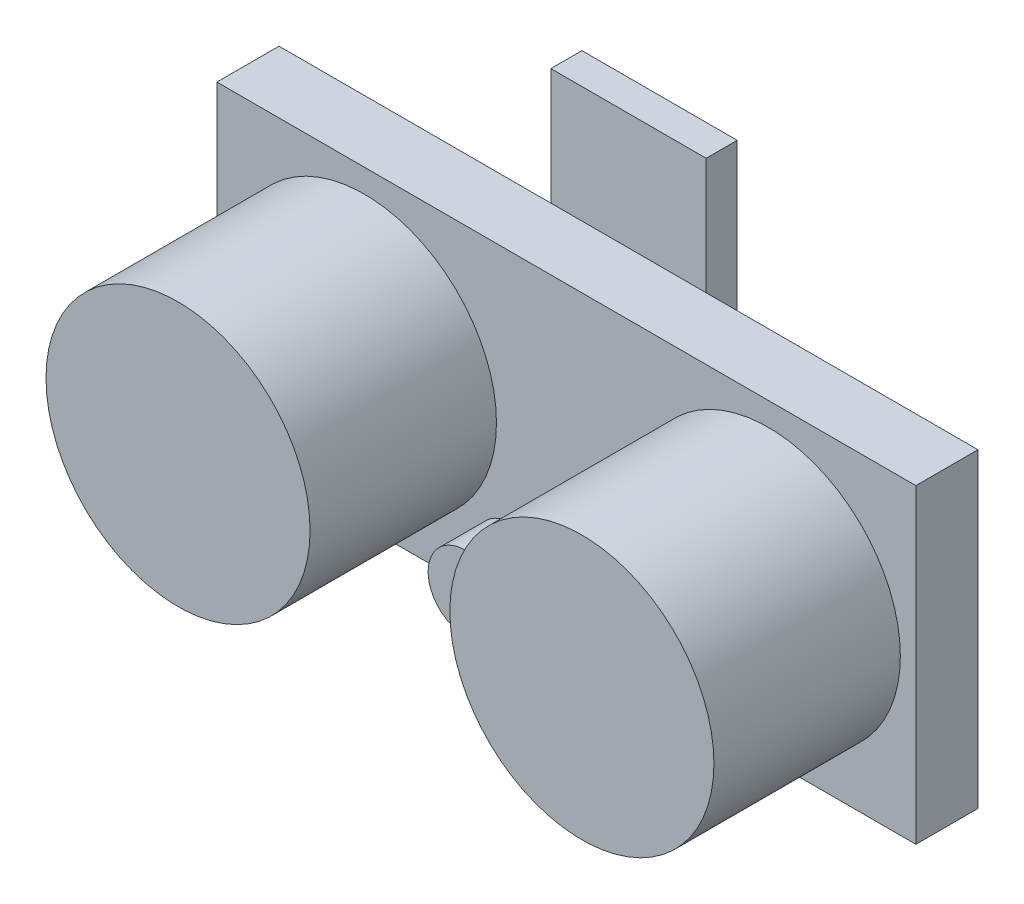
ISO-10303-21;
HEADER;
FILE_DESCRIPTION(('STEP AP214'),'2;1');
FILE_NAME('part.step','',(''),(''),'','','');
FILE_SCHEMA(('AUTOMOTIVE_DESIGN { 1 0 10303 214 1 1 1 1 }'));
ENDSEC;
DATA;
#1=APPLICATION_CONTEXT('core data for automotive mechanical design processes');
#2=APPLICATION_PROTOCOL_DEFINITION('international standard','automotive_design',2000,#1);
#3=PRODUCT_CONTEXT('',#1,'mechanical');
#4=PRODUCT('Part','Part','',(#3));
#5=PRODUCT_RELATED_PRODUCT_CATEGORY('part','',(#4));
#6=PRODUCT_DEFINITION_FORMATION('','',#4);
#7=PRODUCT_DEFINITION_CONTEXT('part definition',#1,'design');
#8=PRODUCT_DEFINITION('design','',#6,#7);
#9=PRODUCT_DEFINITION_SHAPE('','',#8);
#10=(LENGTH_UNIT() NAMED_UNIT(*) SI_UNIT(.MILLI.,.METRE.));
#11=(NAMED_UNIT(*) PLANE_ANGLE_UNIT() SI_UNIT($,.RADIAN.));
#12=(NAMED_UNIT(*) SI_UNIT($,.STERADIAN.) SOLID_ANGLE_UNIT());
#13=UNCERTAINTY_MEASURE_WITH_UNIT(LENGTH_MEASURE(1.E-05),#10,'distance_accuracy_value','');
#14=(GEOMETRIC_REPRESENTATION_CONTEXT(3) GLOBAL_UNCERTAINTY_ASSIGNED_CONTEXT((#13)) GLOBAL_UNIT_ASSIGNED_CONTEXT((#10,
#11,#12)) REPRESENTATION_CONTEXT('',''));
#15=CARTESIAN_POINT('',(0.,0.,0.));
#16=DIRECTION('',(0.,0.,1.));
#17=DIRECTION('',(1.,0.,0.));
#18=AXIS2_PLACEMENT_3D('',#15,#16,#17);
#19=CARTESIAN_POINT('',(0.,0.,4.));
#20=DIRECTION('',(0.,0.,1.));
#21=DIRECTION('',(1.,0.,0.));
#22=AXIS2_PLACEMENT_3D('',#19,#20,#21);
#23=PLANE('',#22);
#24=CARTESIAN_POINT('',(13.,0.,4.));
#25=DIRECTION('',(0.,0.,1.));
#26=DIRECTION('',(-1.,0.,0.));
#27=AXIS2_PLACEMENT_3D('',#24,#25,#26);
#28=CIRCLE('',#27,8.5);
#29=CARTESIAN_POINT('',(4.5,0.,4.));
#30=VERTEX_POINT('',#29);
#31=EDGE_CURVE('E159',#30,#30,#28,.T.);
#32=ORIENTED_EDGE('',*,*,#31,.F.);
#33=EDGE_LOOP('',(#32));
#34=FACE_BOUND('',#33,.T.);
#35=CARTESIAN_POINT('',(-13.,0.,4.));
#36=DIRECTION('',(0.,0.,1.));
#37=DIRECTION('',(1.,0.,0.));
#38=AXIS2_PLACEMENT_3D('',#35,#36,#37);
#39=CIRCLE('',#38,8.5);
#40=CARTESIAN_POINT('',(-4.5,0.,4.));
#41=VERTEX_POINT('',#40);
#42=EDGE_CURVE('E168',#41,#41,#39,.T.);
#43=ORIENTED_EDGE('',*,*,#42,.F.);
#44=EDGE_LOOP('',(#43));
#45=FACE_BOUND('',#44,.T.);
#46=DIRECTION('',(0.,-1.,0.));
#47=VECTOR('',#46,1.);
#48=CARTESIAN_POINT('',(-22.5,-10.,4.));
#49=LINE('',#48,#47);
#50=CARTESIAN_POINT('',(-22.5,9.99999999999999,4.));
#51=VERTEX_POINT('',#50);
#52=CARTESIAN_POINT('',(-22.5,-10.,4.));
#53=VERTEX_POINT('',#52);
#54=EDGE_CURVE('E205',#51,#53,#49,.T.);
#55=ORIENTED_EDGE('',*,*,#54,.T.);
#56=DIRECTION('',(1.,0.,0.));
#57=VECTOR('',#56,1.);
#58=CARTESIAN_POINT('',(22.5,-10.,4.));
#59=LINE('',#58,#57);
#60=CARTESIAN_POINT('',(22.5,-10.,4.));
#61=VERTEX_POINT('',#60);
#62=EDGE_CURVE('E208',#53,#61,#59,.T.);
#63=ORIENTED_EDGE('',*,*,#62,.T.);
#64=DIRECTION('',(0.,1.,0.));
#65=VECTOR('',#64,1.);
#66=CARTESIAN_POINT('',(22.5,-10.,4.));
#67=LINE('',#66,#65);
#68=CARTESIAN_POINT('',(22.5,10.,4.));
#69=VERTEX_POINT('',#68);
#70=EDGE_CURVE('E211',#61,#69,#67,.T.);
#71=ORIENTED_EDGE('',*,*,#70,.T.);
#72=DIRECTION('',(-1.,0.,0.));
#73=VECTOR('',#72,1.);
#74=CARTESIAN_POINT('',(22.5,10.,4.));
#75=LINE('',#74,#73);
#76=EDGE_CURVE('E213',#69,#51,#75,.T.);
#77=ORIENTED_EDGE('',*,*,#76,.T.);
#78=EDGE_LOOP('',(#55,#63,#71,#77));
#79=FACE_BOUND('',#78,.T.);
#80=DIRECTION('',(-1.,0.,0.));
#81=VECTOR('',#80,1.);
#82=CARTESIAN_POINT('',(3.5,-5.1,4.));
#83=LINE('',#82,#81);
#84=CARTESIAN_POINT('',(3.5,-5.1,4.));
#85=VERTEX_POINT('',#84);
#86=CARTESIAN_POINT('',(-3.5,-5.1,4.));
#87=VERTEX_POINT('',#86);
#88=EDGE_CURVE('E259',#85,#87,#83,.T.);
#89=ORIENTED_EDGE('',*,*,#88,.F.);
#90=CARTESIAN_POINT('',(3.5,-7.5,4.));
#91=DIRECTION('',(0.,0.,1.));
#92=DIRECTION('',(1.,0.,0.));
#93=AXIS2_PLACEMENT_3D('',#90,#91,#92);
#94=CIRCLE('',#93,2.4);
#95=CARTESIAN_POINT('',(3.5,-9.9,4.));
#96=VERTEX_POINT('',#95);
#97=EDGE_CURVE('E157',#96,#85,#94,.T.);
#98=ORIENTED_EDGE('',*,*,#97,.F.);
#99=DIRECTION('',(1.,0.,0.));
#100=VECTOR('',#99,1.);
#101=CARTESIAN_POINT('',(3.5,-9.9,4.));
#102=LINE('',#101,#100);
#103=CARTESIAN_POINT('',(-3.5,-9.9,4.));
#104=VERTEX_POINT('',#103);
#105=EDGE_CURVE('E153',#104,#96,#102,.T.);
#106=ORIENTED_EDGE('',*,*,#105,.F.);
#107=CARTESIAN_POINT('',(-3.5,-7.5,4.));
#108=DIRECTION('',(0.,0.,1.));
#109=DIRECTION('',(1.,0.,0.));
#110=AXIS2_PLACEMENT_3D('',#107,#108,#109);
#111=CIRCLE('',#110,2.4);
#112=EDGE_CURVE('E261',#87,#104,#111,.T.);
#113=ORIENTED_EDGE('',*,*,#112,.F.);
#114=EDGE_LOOP('',(#89,#98,#106,#113));
#115=FACE_BOUND('',#114,.T.);
#116=ADVANCED_FACE('F38',(#34,#45,#79,#115),#23,.T.);
#117=CARTESIAN_POINT('',(0.,0.,0.));
#118=DIRECTION('',(0.,0.,1.));
#119=DIRECTION('',(1.,0.,0.));
#120=AXIS2_PLACEMENT_3D('',#117,#118,#119);
#121=PLANE('',#120);
#122=DIRECTION('',(0.,-1.,0.));
#123=VECTOR('',#122,1.);
#124=CARTESIAN_POINT('',(5.,17.5,0.));
#125=LINE('',#124,#123);
#126=CARTESIAN_POINT('',(5.00000000000001,10.,0.));
#127=VERTEX_POINT('',#126);
#128=CARTESIAN_POINT('',(5.,7.5,0.));
#129=VERTEX_POINT('',#128);
#130=EDGE_CURVE('E11',#127,#129,#125,.T.);
#131=ORIENTED_EDGE('',*,*,#130,.F.);
#132=DIRECTION('',(-1.,0.,0.));
#133=VECTOR('',#132,1.);
#134=CARTESIAN_POINT('',(22.5,10.,0.));
#135=LINE('',#134,#133);
#136=CARTESIAN_POINT('',(22.5,10.,0.));
#137=VERTEX_POINT('',#136);
#138=EDGE_CURVE('E209',#137,#127,#135,.T.);
#139=ORIENTED_EDGE('',*,*,#138,.F.);
#140=DIRECTION('',(0.,1.,0.));
#141=VECTOR('',#140,1.);
#142=CARTESIAN_POINT('',(22.5,-10.,0.));
#143=LINE('',#142,#141);
#144=CARTESIAN_POINT('',(22.5,-10.,0.));
#145=VERTEX_POINT('',#144);
#146=EDGE_CURVE('E220',#145,#137,#143,.T.);
#147=ORIENTED_EDGE('',*,*,#146,.F.);
#148=DIRECTION('',(1.,0.,0.));
#149=VECTOR('',#148,1.);
#150=CARTESIAN_POINT('',(22.5,-10.,0.));
#151=LINE('',#150,#149);
#152=CARTESIAN_POINT('',(-22.5,-10.,0.));
#153=VERTEX_POINT('',#152);
#154=EDGE_CURVE('E218',#153,#145,#151,.T.);
#155=ORIENTED_EDGE('',*,*,#154,.F.);
#156=DIRECTION('',(0.,-1.,0.));
#157=VECTOR('',#156,1.);
#158=CARTESIAN_POINT('',(-22.5,-10.,0.));
#159=LINE('',#158,#157);
#160=CARTESIAN_POINT('',(-22.5,9.99999999999999,0.));
#161=VERTEX_POINT('',#160);
#162=EDGE_CURVE('E204',#161,#153,#159,.T.);
#163=ORIENTED_EDGE('',*,*,#162,.F.);
#164=CARTESIAN_POINT('',(-4.99999999999999,10.,0.));
#165=VERTEX_POINT('',#164);
#166=EDGE_CURVE('E222',#165,#161,#135,.T.);
#167=ORIENTED_EDGE('',*,*,#166,.F.);
#168=DIRECTION('',(0.,1.,0.));
#169=VECTOR('',#168,1.);
#170=CARTESIAN_POINT('',(-5.,17.5,0.));
#171=LINE('',#170,#169);
#172=CARTESIAN_POINT('',(-5.,7.5,0.));
#173=VERTEX_POINT('',#172);
#174=EDGE_CURVE('E189',#173,#165,#171,.T.);
#175=ORIENTED_EDGE('',*,*,#174,.F.);
#176=DIRECTION('',(-1.,0.,0.));
#177=VECTOR('',#176,1.);
#178=CARTESIAN_POINT('',(5.,7.5,0.));
#179=LINE('',#178,#177);
#180=EDGE_CURVE('E63',#129,#173,#179,.T.);
#181=ORIENTED_EDGE('',*,*,#180,.F.);
#182=EDGE_LOOP('',(#131,#139,#147,#155,#163,#167,#175,#181));
#183=FACE_BOUND('',#182,.T.);
#184=ADVANCED_FACE('F244',(#183),#121,.F.);
#185=CARTESIAN_POINT('',(-22.5,-10.,4.));
#186=DIRECTION('',(1.,0.,0.));
#187=DIRECTION('',(0.,0.,-1.));
#188=AXIS2_PLACEMENT_3D('',#185,#186,#187);
#189=PLANE('',#188);
#190=ORIENTED_EDGE('',*,*,#162,.T.);
#191=DIRECTION('',(0.,0.,-1.));
#192=VECTOR('',#191,1.);
#193=CARTESIAN_POINT('',(-22.5,-10.,4.));
#194=LINE('',#193,#192);
#195=EDGE_CURVE('E42',#53,#153,#194,.T.);
#196=ORIENTED_EDGE('',*,*,#195,.F.);
#197=ORIENTED_EDGE('',*,*,#54,.F.);
#198=DIRECTION('',(0.,0.,-1.));
#199=VECTOR('',#198,1.);
#200=CARTESIAN_POINT('',(-22.5,9.99999999999999,4.));
#201=LINE('',#200,#199);
#202=EDGE_CURVE('E215',#51,#161,#201,.T.);
#203=ORIENTED_EDGE('',*,*,#202,.T.);
#204=EDGE_LOOP('',(#190,#196,#197,#203));
#205=FACE_BOUND('',#204,.T.);
#206=ADVANCED_FACE('F40',(#205),#189,.F.);
#207=CARTESIAN_POINT('',(22.5,-10.,4.));
#208=DIRECTION('',(0.,1.,0.));
#209=DIRECTION('',(-1.,0.,0.));
#210=AXIS2_PLACEMENT_3D('',#207,#208,#209);
#211=PLANE('',#210);
#212=ORIENTED_EDGE('',*,*,#154,.T.);
#213=DIRECTION('',(0.,0.,-1.));
#214=VECTOR('',#213,1.);
#215=CARTESIAN_POINT('',(22.5,-10.,4.));
#216=LINE('',#215,#214);
#217=EDGE_CURVE('E230',#61,#145,#216,.T.);
#218=ORIENTED_EDGE('',*,*,#217,.F.);
#219=ORIENTED_EDGE('',*,*,#62,.F.);
#220=ORIENTED_EDGE('',*,*,#195,.T.);
#221=EDGE_LOOP('',(#212,#218,#219,#220));
#222=FACE_BOUND('',#221,.T.);
#223=ADVANCED_FACE('F239',(#222),#211,.F.);
#224=CARTESIAN_POINT('',(22.5,-10.,4.));
#225=DIRECTION('',(-1.,0.,0.));
#226=DIRECTION('',(0.,0.,1.));
#227=AXIS2_PLACEMENT_3D('',#224,#225,#226);
#228=PLANE('',#227);
#229=ORIENTED_EDGE('',*,*,#146,.T.);
#230=DIRECTION('',(0.,0.,-1.));
#231=VECTOR('',#230,1.);
#232=CARTESIAN_POINT('',(22.5,10.,4.));
#233=LINE('',#232,#231);
#234=EDGE_CURVE('E228',#69,#137,#233,.T.);
#235=ORIENTED_EDGE('',*,*,#234,.F.);
#236=ORIENTED_EDGE('',*,*,#70,.F.);
#237=ORIENTED_EDGE('',*,*,#217,.T.);
#238=EDGE_LOOP('',(#229,#235,#236,#237));
#239=FACE_BOUND('',#238,.T.);
#240=ADVANCED_FACE('F248',(#239),#228,.F.);
#241=CARTESIAN_POINT('',(22.5,10.,4.));
#242=DIRECTION('',(0.,-1.,0.));
#243=DIRECTION('',(1.,0.,0.));
#244=AXIS2_PLACEMENT_3D('',#241,#242,#243);
#245=PLANE('',#244);
#246=ORIENTED_EDGE('',*,*,#138,.T.);
#247=EDGE_CURVE('E225',#127,#165,#135,.T.);
#248=ORIENTED_EDGE('',*,*,#247,.T.);
#249=ORIENTED_EDGE('',*,*,#166,.T.);
#250=ORIENTED_EDGE('',*,*,#202,.F.);
#251=ORIENTED_EDGE('',*,*,#76,.F.);
#252=ORIENTED_EDGE('',*,*,#234,.T.);
#253=EDGE_LOOP('',(#246,#248,#249,#250,#251,#252));
#254=FACE_BOUND('',#253,.T.);
#255=ADVANCED_FACE('F251',(#254),#245,.F.);
#256=CARTESIAN_POINT('',(5.,17.5,-2.));
#257=DIRECTION('',(-1.,0.,0.));
#258=DIRECTION('',(0.,-1.,0.));
#259=AXIS2_PLACEMENT_3D('',#256,#257,#258);
#260=PLANE('',#259);
#261=CARTESIAN_POINT('',(5.,17.5,0.));
#262=VERTEX_POINT('',#261);
#263=EDGE_CURVE('E48',#262,#127,#125,.T.);
#264=ORIENTED_EDGE('',*,*,#263,.T.);
#265=ORIENTED_EDGE('',*,*,#130,.T.);
#266=DIRECTION('',(0.,0.,1.));
#267=VECTOR('',#266,1.);
#268=CARTESIAN_POINT('',(5.,7.5,-2.));
#269=LINE('',#268,#267);
#270=CARTESIAN_POINT('',(5.,7.5,-2.));
#271=VERTEX_POINT('',#270);
#272=EDGE_CURVE('E201',#271,#129,#269,.T.);
#273=ORIENTED_EDGE('',*,*,#272,.F.);
#274=DIRECTION('',(0.,-1.,0.));
#275=VECTOR('',#274,1.);
#276=CARTESIAN_POINT('',(5.,17.5,-2.));
#277=LINE('',#276,#275);
#278=CARTESIAN_POINT('',(5.,17.5,-2.));
#279=VERTEX_POINT('',#278);
#280=EDGE_CURVE('E175',#279,#271,#277,.T.);
#281=ORIENTED_EDGE('',*,*,#280,.F.);
#282=DIRECTION('',(0.,0.,1.));
#283=VECTOR('',#282,1.);
#284=CARTESIAN_POINT('',(5.,17.5,-2.));
#285=LINE('',#284,#283);
#286=EDGE_CURVE('E184',#279,#262,#285,.T.);
#287=ORIENTED_EDGE('',*,*,#286,.T.);
#288=EDGE_LOOP('',(#264,#265,#273,#281,#287));
#289=FACE_BOUND('',#288,.T.);
#290=ADVANCED_FACE('F321',(#289),#260,.F.);
#291=CARTESIAN_POINT('',(5.,7.5,-2.));
#292=DIRECTION('',(0.,1.,0.));
#293=DIRECTION('',(0.,0.,1.));
#294=AXIS2_PLACEMENT_3D('',#291,#292,#293);
#295=PLANE('',#294);
#296=ORIENTED_EDGE('',*,*,#180,.T.);
#297=DIRECTION('',(0.,0.,1.));
#298=VECTOR('',#297,1.);
#299=CARTESIAN_POINT('',(-5.,7.5,-2.));
#300=LINE('',#299,#298);
#301=CARTESIAN_POINT('',(-5.,7.5,-2.));
#302=VERTEX_POINT('',#301);
#303=EDGE_CURVE('E198',#302,#173,#300,.T.);
#304=ORIENTED_EDGE('',*,*,#303,.F.);
#305=DIRECTION('',(-1.,0.,0.));
#306=VECTOR('',#305,1.);
#307=CARTESIAN_POINT('',(5.,7.5,-2.));
#308=LINE('',#307,#306);
#309=EDGE_CURVE('E178',#271,#302,#308,.T.);
#310=ORIENTED_EDGE('',*,*,#309,.F.);
#311=ORIENTED_EDGE('',*,*,#272,.T.);
#312=EDGE_LOOP('',(#296,#304,#310,#311));
#313=FACE_BOUND('',#312,.T.);
#314=ADVANCED_FACE('F317',(#313),#295,.F.);
#315=CARTESIAN_POINT('',(-5.,17.5,-2.));
#316=DIRECTION('',(1.,0.,0.));
#317=DIRECTION('',(0.,1.,0.));
#318=AXIS2_PLACEMENT_3D('',#315,#316,#317);
#319=PLANE('',#318);
#320=ORIENTED_EDGE('',*,*,#174,.T.);
#321=CARTESIAN_POINT('',(-5.,17.5,0.));
#322=VERTEX_POINT('',#321);
#323=EDGE_CURVE('E188',#165,#322,#171,.T.);
#324=ORIENTED_EDGE('',*,*,#323,.T.);
#325=DIRECTION('',(0.,0.,1.));
#326=VECTOR('',#325,1.);
#327=CARTESIAN_POINT('',(-5.,17.5,-2.));
#328=LINE('',#327,#326);
#329=CARTESIAN_POINT('',(-5.,17.5,-2.));
#330=VERTEX_POINT('',#329);
#331=EDGE_CURVE('E195',#330,#322,#328,.T.);
#332=ORIENTED_EDGE('',*,*,#331,.F.);
#333=DIRECTION('',(0.,1.,0.));
#334=VECTOR('',#333,1.);
#335=CARTESIAN_POINT('',(-5.,17.5,-2.));
#336=LINE('',#335,#334);
#337=EDGE_CURVE('E181',#302,#330,#336,.T.);
#338=ORIENTED_EDGE('',*,*,#337,.F.);
#339=ORIENTED_EDGE('',*,*,#303,.T.);
#340=EDGE_LOOP('',(#320,#324,#332,#338,#339));
#341=FACE_BOUND('',#340,.T.);
#342=ADVANCED_FACE('F313',(#341),#319,.F.);
#343=CARTESIAN_POINT('',(5.,17.5,-2.));
#344=DIRECTION('',(0.,-1.,0.));
#345=DIRECTION('',(0.,0.,-1.));
#346=AXIS2_PLACEMENT_3D('',#343,#344,#345);
#347=PLANE('',#346);
#348=DIRECTION('',(1.,0.,0.));
#349=VECTOR('',#348,1.);
#350=CARTESIAN_POINT('',(5.,17.5,0.));
#351=LINE('',#350,#349);
#352=EDGE_CURVE('E179',#322,#262,#351,.T.);
#353=ORIENTED_EDGE('',*,*,#352,.T.);
#354=ORIENTED_EDGE('',*,*,#286,.F.);
#355=DIRECTION('',(1.,0.,0.));
#356=VECTOR('',#355,1.);
#357=CARTESIAN_POINT('',(5.,17.5,-2.));
#358=LINE('',#357,#356);
#359=EDGE_CURVE('E183',#330,#279,#358,.T.);
#360=ORIENTED_EDGE('',*,*,#359,.F.);
#361=ORIENTED_EDGE('',*,*,#331,.T.);
#362=EDGE_LOOP('',(#353,#354,#360,#361));
#363=FACE_BOUND('',#362,.T.);
#364=ADVANCED_FACE('F306',(#363),#347,.F.);
#365=CARTESIAN_POINT('',(0.,0.,-2.));
#366=DIRECTION('',(0.,0.,-1.));
#367=DIRECTION('',(-1.,0.,0.));
#368=AXIS2_PLACEMENT_3D('',#365,#366,#367);
#369=PLANE('',#368);
#370=ORIENTED_EDGE('',*,*,#280,.T.);
#371=ORIENTED_EDGE('',*,*,#309,.T.);
#372=ORIENTED_EDGE('',*,*,#337,.T.);
#373=ORIENTED_EDGE('',*,*,#359,.T.);
#374=EDGE_LOOP('',(#370,#371,#372,#373));
#375=FACE_BOUND('',#374,.T.);
#376=ADVANCED_FACE('F303',(#375),#369,.T.);
#377=CARTESIAN_POINT('',(0.,0.,0.));
#378=DIRECTION('',(0.,0.,-1.));
#379=DIRECTION('',(-1.,0.,0.));
#380=AXIS2_PLACEMENT_3D('',#377,#378,#379);
#381=PLANE('',#380);
#382=ORIENTED_EDGE('',*,*,#247,.F.);
#383=ORIENTED_EDGE('',*,*,#263,.F.);
#384=ORIENTED_EDGE('',*,*,#352,.F.);
#385=ORIENTED_EDGE('',*,*,#323,.F.);
#386=EDGE_LOOP('',(#382,#383,#384,#385));
#387=FACE_BOUND('',#386,.T.);
#388=ADVANCED_FACE('F301',(#387),#381,.F.);
#389=CARTESIAN_POINT('',(-13.,0.,16.));
#390=DIRECTION('',(0.,0.,-1.));
#391=DIRECTION('',(-1.,0.,0.));
#392=AXIS2_PLACEMENT_3D('',#389,#390,#391);
#393=CYLINDRICAL_SURFACE('',#392,8.5);
#394=CARTESIAN_POINT('',(-13.,0.,16.));
#395=DIRECTION('',(0.,0.,1.));
#396=DIRECTION('',(1.,0.,0.));
#397=AXIS2_PLACEMENT_3D('',#394,#395,#396);
#398=CIRCLE('',#397,8.5);
#399=CARTESIAN_POINT('',(-4.5,0.,16.));
#400=VERTEX_POINT('',#399);
#401=EDGE_CURVE('E170',#400,#400,#398,.T.);
#402=ORIENTED_EDGE('',*,*,#401,.F.);
#403=EDGE_LOOP('',(#402));
#404=FACE_BOUND('',#403,.T.);
#405=ORIENTED_EDGE('',*,*,#42,.T.);
#406=EDGE_LOOP('',(#405));
#407=FACE_BOUND('',#406,.T.);
#408=ADVANCED_FACE('F297',(#404,#407),#393,.T.);
#409=CARTESIAN_POINT('',(-13.,0.,16.));
#410=DIRECTION('',(0.,0.,1.));
#411=DIRECTION('',(1.,0.,0.));
#412=AXIS2_PLACEMENT_3D('',#409,#410,#411);
#413=PLANE('',#412);
#414=ORIENTED_EDGE('',*,*,#401,.T.);
#415=EDGE_LOOP('',(#414));
#416=FACE_BOUND('',#415,.T.);
#417=ADVANCED_FACE('F293',(#416),#413,.T.);
#418=CARTESIAN_POINT('',(13.,0.,16.));
#419=DIRECTION('',(0.,0.,-1.));
#420=DIRECTION('',(-1.,0.,0.));
#421=AXIS2_PLACEMENT_3D('',#418,#419,#420);
#422=CYLINDRICAL_SURFACE('',#421,8.5);
#423=CARTESIAN_POINT('',(13.,0.,16.));
#424=DIRECTION('',(0.,0.,1.));
#425=DIRECTION('',(-1.,0.,0.));
#426=AXIS2_PLACEMENT_3D('',#423,#424,#425);
#427=CIRCLE('',#426,8.5);
#428=CARTESIAN_POINT('',(4.5,0.,16.));
#429=VERTEX_POINT('',#428);
#430=EDGE_CURVE('E162',#429,#429,#427,.T.);
#431=ORIENTED_EDGE('',*,*,#430,.F.);
#432=EDGE_LOOP('',(#431));
#433=FACE_BOUND('',#432,.T.);
#434=ORIENTED_EDGE('',*,*,#31,.T.);
#435=EDGE_LOOP('',(#434));
#436=FACE_BOUND('',#435,.T.);
#437=ADVANCED_FACE('F289',(#433,#436),#422,.T.);
#438=CARTESIAN_POINT('',(13.,0.,16.));
#439=DIRECTION('',(0.,0.,-1.));
#440=DIRECTION('',(-1.,0.,0.));
#441=AXIS2_PLACEMENT_3D('',#438,#439,#440);
#442=PLANE('',#441);
#443=ORIENTED_EDGE('',*,*,#430,.T.);
#444=EDGE_LOOP('',(#443));
#445=FACE_BOUND('',#444,.T.);
#446=ADVANCED_FACE('F286',(#445),#442,.F.);
#447=CARTESIAN_POINT('',(3.5,-7.5,7.));
#448=DIRECTION('',(0.,0.,-1.));
#449=DIRECTION('',(-1.,0.,0.));
#450=AXIS2_PLACEMENT_3D('',#447,#448,#449);
#451=CYLINDRICAL_SURFACE('',#450,2.4);
#452=ORIENTED_EDGE('',*,*,#97,.T.);
#453=DIRECTION('',(0.,0.,-1.));
#454=VECTOR('',#453,1.);
#455=CARTESIAN_POINT('',(3.5,-5.1,7.));
#456=LINE('',#455,#454);
#457=CARTESIAN_POINT('',(3.5,-5.1,7.));
#458=VERTEX_POINT('',#457);
#459=EDGE_CURVE('E138',#458,#85,#456,.T.);
#460=ORIENTED_EDGE('',*,*,#459,.F.);
#461=CARTESIAN_POINT('',(3.5,-7.5,7.));
#462=DIRECTION('',(0.,0.,1.));
#463=DIRECTION('',(1.,0.,0.));
#464=AXIS2_PLACEMENT_3D('',#461,#462,#463);
#465=CIRCLE('',#464,2.4);
#466=CARTESIAN_POINT('',(3.5,-9.9,7.));
#467=VERTEX_POINT('',#466);
#468=EDGE_CURVE('E145',#467,#458,#465,.T.);
#469=ORIENTED_EDGE('',*,*,#468,.F.);
#470=DIRECTION('',(0.,0.,-1.));
#471=VECTOR('',#470,1.);
#472=CARTESIAN_POINT('',(3.5,-9.9,7.));
#473=LINE('',#472,#471);
#474=EDGE_CURVE('E268',#467,#96,#473,.T.);
#475=ORIENTED_EDGE('',*,*,#474,.T.);
#476=EDGE_LOOP('',(#452,#460,#469,#475));
#477=FACE_BOUND('',#476,.T.);
#478=ADVANCED_FACE('F155',(#477),#451,.T.);
#479=CARTESIAN_POINT('',(3.5,-5.1,7.));
#480=DIRECTION('',(0.,-1.,0.));
#481=DIRECTION('',(1.,0.,0.));
#482=AXIS2_PLACEMENT_3D('',#479,#480,#481);
#483=PLANE('',#482);
#484=ORIENTED_EDGE('',*,*,#88,.T.);
#485=DIRECTION('',(0.,0.,-1.));
#486=VECTOR('',#485,1.);
#487=CARTESIAN_POINT('',(-3.5,-5.1,7.));
#488=LINE('',#487,#486);
#489=CARTESIAN_POINT('',(-3.5,-5.1,7.));
#490=VERTEX_POINT('',#489);
#491=EDGE_CURVE('E141',#490,#87,#488,.T.);
#492=ORIENTED_EDGE('',*,*,#491,.F.);
#493=DIRECTION('',(-1.,0.,0.));
#494=VECTOR('',#493,1.);
#495=CARTESIAN_POINT('',(3.5,-5.1,7.));
#496=LINE('',#495,#494);
#497=EDGE_CURVE('E134',#458,#490,#496,.T.);
#498=ORIENTED_EDGE('',*,*,#497,.F.);
#499=ORIENTED_EDGE('',*,*,#459,.T.);
#500=EDGE_LOOP('',(#484,#492,#498,#499));
#501=FACE_BOUND('',#500,.T.);
#502=ADVANCED_FACE('F136',(#501),#483,.F.);
#503=CARTESIAN_POINT('',(-3.5,-7.5,7.));
#504=DIRECTION('',(0.,0.,-1.));
#505=DIRECTION('',(-1.,0.,0.));
#506=AXIS2_PLACEMENT_3D('',#503,#504,#505);
#507=CYLINDRICAL_SURFACE('',#506,2.4);
#508=ORIENTED_EDGE('',*,*,#112,.T.);
#509=DIRECTION('',(0.,0.,-1.));
#510=VECTOR('',#509,1.);
#511=CARTESIAN_POINT('',(-3.5,-9.9,7.));
#512=LINE('',#511,#510);
#513=CARTESIAN_POINT('',(-3.5,-9.9,7.));
#514=VERTEX_POINT('',#513);
#515=EDGE_CURVE('E55',#514,#104,#512,.T.);
#516=ORIENTED_EDGE('',*,*,#515,.F.);
#517=CARTESIAN_POINT('',(-3.5,-7.5,7.));
#518=DIRECTION('',(0.,0.,1.));
#519=DIRECTION('',(1.,0.,0.));
#520=AXIS2_PLACEMENT_3D('',#517,#518,#519);
#521=CIRCLE('',#520,2.4);
#522=EDGE_CURVE('E144',#490,#514,#521,.T.);
#523=ORIENTED_EDGE('',*,*,#522,.F.);
#524=ORIENTED_EDGE('',*,*,#491,.T.);
#525=EDGE_LOOP('',(#508,#516,#523,#524));
#526=FACE_BOUND('',#525,.T.);
#527=ADVANCED_FACE('F271',(#526),#507,.T.);
#528=CARTESIAN_POINT('',(3.5,-9.9,7.));
#529=DIRECTION('',(0.,1.,0.));
#530=DIRECTION('',(0.,0.,1.));
#531=AXIS2_PLACEMENT_3D('',#528,#529,#530);
#532=PLANE('',#531);
#533=ORIENTED_EDGE('',*,*,#105,.T.);
#534=ORIENTED_EDGE('',*,*,#474,.F.);
#535=DIRECTION('',(1.,0.,0.));
#536=VECTOR('',#535,1.);
#537=CARTESIAN_POINT('',(3.5,-9.9,7.));
#538=LINE('',#537,#536);
#539=EDGE_CURVE('E149',#514,#467,#538,.T.);
#540=ORIENTED_EDGE('',*,*,#539,.F.);
#541=ORIENTED_EDGE('',*,*,#515,.T.);
#542=EDGE_LOOP('',(#533,#534,#540,#541));
#543=FACE_BOUND('',#542,.T.);
#544=ADVANCED_FACE('F272',(#543),#532,.F.);
#545=CARTESIAN_POINT('',(3.5,-7.5,7.));
#546=DIRECTION('',(0.,0.,1.));
#547=DIRECTION('',(1.,0.,0.));
#548=AXIS2_PLACEMENT_3D('',#545,#546,#547);
#549=PLANE('',#548);
#550=ORIENTED_EDGE('',*,*,#468,.T.);
#551=ORIENTED_EDGE('',*,*,#497,.T.);
#552=ORIENTED_EDGE('',*,*,#522,.T.);
#553=ORIENTED_EDGE('',*,*,#539,.T.);
#554=EDGE_LOOP('',(#550,#551,#552,#553));
#555=FACE_BOUND('',#554,.T.);
#556=ADVANCED_FACE('F148',(#555),#549,.T.);
#557=CLOSED_SHELL('',(#116,#184,#206,#223,#240,#255,#290,#314,#342,#364,#376,#388,#408,#417,
#437,#446,#478,#502,#527,#544,#556));
#558=MANIFOLD_SOLID_BREP('B2',#557);
#559=ADVANCED_BREP_SHAPE_REPRESENTATION('',(#18,#558),#14);
#560=SHAPE_DEFINITION_REPRESENTATION(#9,#559);
ENDSEC;
END-ISO-10303-21;
